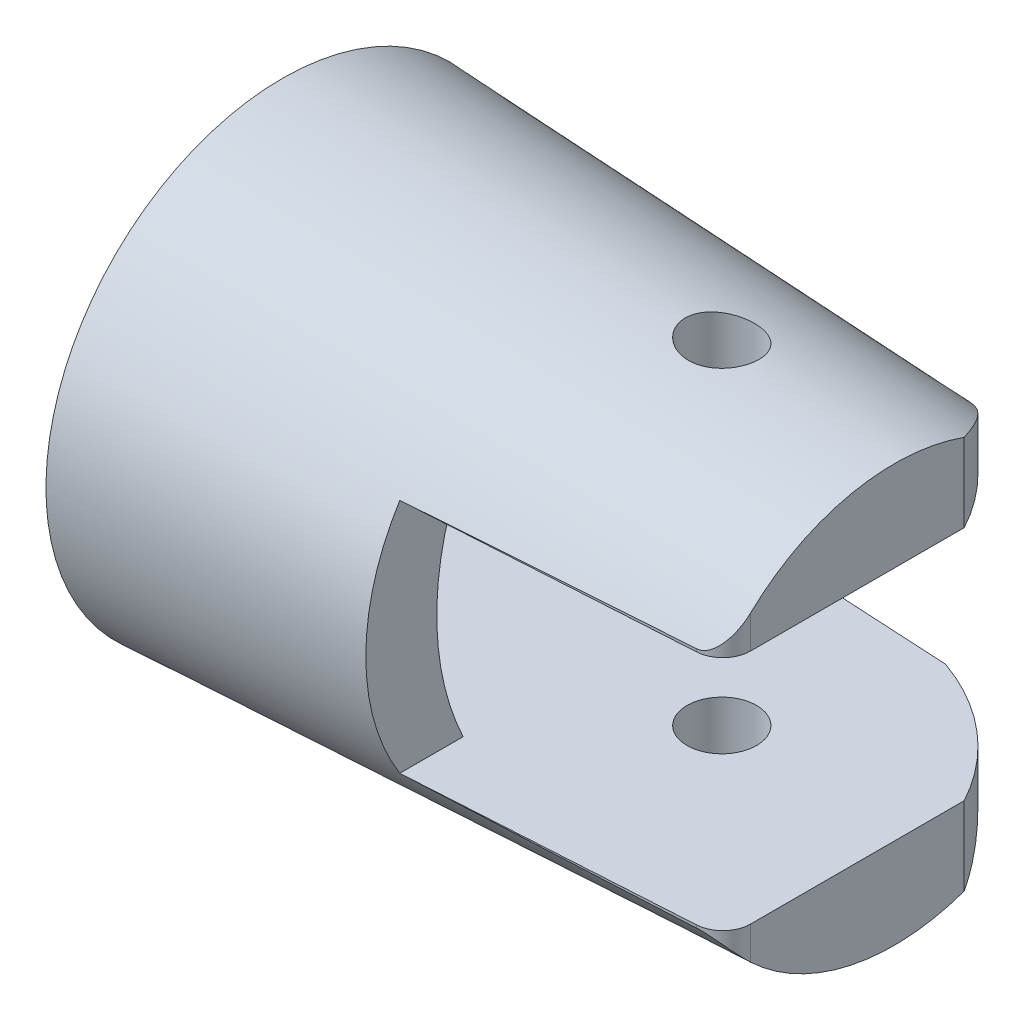
ISO-10303-21;
HEADER;
FILE_DESCRIPTION(('STEP AP214'),'2;1');
FILE_NAME('part.step','',(''),(''),'','','');
FILE_SCHEMA(('AUTOMOTIVE_DESIGN { 1 0 10303 214 1 1 1 1 }'));
ENDSEC;
DATA;
#1=APPLICATION_CONTEXT('core data for automotive mechanical design processes');
#2=APPLICATION_PROTOCOL_DEFINITION('international standard','automotive_design',2000,#1);
#3=PRODUCT_CONTEXT('',#1,'mechanical');
#4=PRODUCT('Part','Part','',(#3));
#5=PRODUCT_RELATED_PRODUCT_CATEGORY('part','',(#4));
#6=PRODUCT_DEFINITION_FORMATION('','',#4);
#7=PRODUCT_DEFINITION_CONTEXT('part definition',#1,'design');
#8=PRODUCT_DEFINITION('design','',#6,#7);
#9=PRODUCT_DEFINITION_SHAPE('','',#8);
#10=(LENGTH_UNIT() NAMED_UNIT(*) SI_UNIT(.MILLI.,.METRE.));
#11=(NAMED_UNIT(*) PLANE_ANGLE_UNIT() SI_UNIT($,.RADIAN.));
#12=(NAMED_UNIT(*) SI_UNIT($,.STERADIAN.) SOLID_ANGLE_UNIT());
#13=UNCERTAINTY_MEASURE_WITH_UNIT(LENGTH_MEASURE(1.E-05),#10,'distance_accuracy_value','');
#14=(GEOMETRIC_REPRESENTATION_CONTEXT(3) GLOBAL_UNCERTAINTY_ASSIGNED_CONTEXT((#13)) GLOBAL_UNIT_ASSIGNED_CONTEXT((#10,
#11,#12)) REPRESENTATION_CONTEXT('',''));
#15=CARTESIAN_POINT('',(0.,0.,0.));
#16=DIRECTION('',(0.,0.,1.));
#17=DIRECTION('',(1.,0.,0.));
#18=AXIS2_PLACEMENT_3D('',#15,#16,#17);
#19=CARTESIAN_POINT('',(11.,4.25,10.));
#20=DIRECTION('',(1.,0.,0.));
#21=DIRECTION('',(0.,1.,0.));
#22=AXIS2_PLACEMENT_3D('',#19,#20,#21);
#23=PLANE('',#22);
#24=CARTESIAN_POINT('',(11.,0.,4.55193349511584));
#25=DIRECTION('',(1.,0.,0.));
#26=DIRECTION('',(0.,1.,0.));
#27=AXIS2_PLACEMENT_3D('',#24,#25,#26);
#28=CIRCLE('',#27,10.);
#29=CARTESIAN_POINT('',(11.,-4.25,-4.5));
#30=VERTEX_POINT('',#29);
#31=CARTESIAN_POINT('',(11.,4.25,-4.5));
#32=VERTEX_POINT('',#31);
#33=EDGE_CURVE('E358',#30,#32,#28,.T.);
#34=ORIENTED_EDGE('',*,*,#33,.F.);
#35=DIRECTION('',(0.,0.,-1.));
#36=VECTOR('',#35,1.);
#37=CARTESIAN_POINT('',(11.,-4.25,10.));
#38=LINE('',#37,#36);
#39=CARTESIAN_POINT('',(11.,-4.25,-6.77772085586298));
#40=VERTEX_POINT('',#39);
#41=EDGE_CURVE('E238',#30,#40,#38,.T.);
#42=ORIENTED_EDGE('',*,*,#41,.T.);
#43=CARTESIAN_POINT('',(11.,0.,0.));
#44=DIRECTION('',(1.,0.,0.));
#45=DIRECTION('',(0.,1.,0.));
#46=AXIS2_PLACEMENT_3D('',#43,#44,#45);
#47=CIRCLE('',#46,8.);
#48=CARTESIAN_POINT('',(11.,4.25,-6.77772085586298));
#49=VERTEX_POINT('',#48);
#50=EDGE_CURVE('E272',#49,#40,#47,.F.);
#51=ORIENTED_EDGE('',*,*,#50,.F.);
#52=DIRECTION('',(0.,0.,-1.));
#53=VECTOR('',#52,1.);
#54=CARTESIAN_POINT('',(11.,4.25,10.));
#55=LINE('',#54,#53);
#56=EDGE_CURVE('E243',#32,#49,#55,.T.);
#57=ORIENTED_EDGE('',*,*,#56,.F.);
#58=EDGE_LOOP('',(#34,#42,#51,#57));
#59=FACE_BOUND('',#58,.T.);
#60=ADVANCED_FACE('F37',(#59),#23,.T.);
#61=CARTESIAN_POINT('',(22.,0.,0.));
#62=DIRECTION('',(-1.,0.,0.));
#63=DIRECTION('',(0.,0.,1.));
#64=AXIS2_PLACEMENT_3D('',#61,#62,#63);
#65=CONICAL_SURFACE('',#64,7.5,0.0454232794215771);
#66=CARTESIAN_POINT('',(14.3941608058607,7.72670680728281,-1.3613683035503));
#67=CARTESIAN_POINT('',(14.4426544610222,7.71548391465483,-1.41236224751293));
#68=CARTESIAN_POINT('',(14.4954875015183,7.70424887281371,-1.45928133671162));
#69=CARTESIAN_POINT('',(14.6084357930975,7.68255265581266,-1.54365513310372));
#70=CARTESIAN_POINT('',(14.6685576532198,7.67209219704693,-1.58110115433035));
#71=CARTESIAN_POINT('',(14.7945004050362,7.65270240022359,-1.64541249257932));
#72=CARTESIAN_POINT('',(14.8603243886682,7.6437739007807,-1.6722720247865));
#73=CARTESIAN_POINT('',(14.9957956663847,7.62810428660344,-1.71449202486371));
#74=CARTESIAN_POINT('',(15.0654416940765,7.62136245239683,-1.72985627717164));
#75=CARTESIAN_POINT('',(15.2052745443432,7.61061659800694,-1.7483636127346));
#76=CARTESIAN_POINT('',(15.2754294883197,7.60656582739482,-1.75172008191131));
#77=CARTESIAN_POINT('',(15.4154144807582,7.60120792507606,-1.74662884758367));
#78=CARTESIAN_POINT('',(15.4852445573659,7.5999005510994,-1.73818218652642));
#79=CARTESIAN_POINT('',(15.6210962962799,7.5999596993806,-1.71000508689467));
#80=CARTESIAN_POINT('',(15.6871665577638,7.60127230540466,-1.69050796574165));
#81=CARTESIAN_POINT('',(15.8151407205646,7.60616665832593,-1.64098116687197));
#82=CARTESIAN_POINT('',(15.877044523267,7.60974845891104,-1.61095123996238));
#83=CARTESIAN_POINT('',(15.9953016125434,7.61872631762937,-1.54105606438817));
#84=CARTESIAN_POINT('',(16.0516250295774,7.62413152144849,-1.50114151098108));
#85=CARTESIAN_POINT('',(16.1568791120356,7.63615109912074,-1.4126804312775));
#86=CARTESIAN_POINT('',(16.2058089763541,7.64276560383257,-1.36413297082777));
#87=CARTESIAN_POINT('',(16.2958843450537,7.65669376395112,-1.25869304955648));
#88=CARTESIAN_POINT('',(16.3368589163514,7.66401856184166,-1.20165596720991));
#89=CARTESIAN_POINT('',(16.4087041841041,7.67859311962624,-1.08152717717293));
#90=CARTESIAN_POINT('',(16.4395743052492,7.68584287522489,-1.01843512499939));
#91=CARTESIAN_POINT('',(16.4905827653885,7.69975341227731,-0.887306796760356));
#92=CARTESIAN_POINT('',(16.5106193398183,7.7064081347361,-0.819230233652647));
#93=CARTESIAN_POINT('',(16.5389103215115,7.71859753901097,-0.680574166422824));
#94=CARTESIAN_POINT('',(16.5471652593735,7.72413227125738,-0.609994775164987));
#95=CARTESIAN_POINT('',(16.55159144621,7.73377753235231,-0.468841500658779));
#96=CARTESIAN_POINT('',(16.5478442256729,7.73789746090987,-0.398270823100492));
#97=CARTESIAN_POINT('',(16.5285102016494,7.74469956105422,-0.258700387536735));
#98=CARTESIAN_POINT('',(16.5129239023689,7.74738179386167,-0.189700562760261));
#99=CARTESIAN_POINT('',(16.4705049686676,7.75142718385602,-0.0558015186554819));
#100=CARTESIAN_POINT('',(16.4437605463657,7.75280041577325,0.00912536689174029));
#101=CARTESIAN_POINT('',(16.3797878281616,7.75456327901398,0.133604971437674));
#102=CARTESIAN_POINT('',(16.3425594055366,7.75495289844774,0.193157625465192));
#103=CARTESIAN_POINT('',(16.2586255688101,7.75516876550879,0.305261109208858));
#104=CARTESIAN_POINT('',(16.2119100087218,7.75499440698649,0.357804342200148));
#105=CARTESIAN_POINT('',(16.1103443963527,7.75456355041053,0.454332452913679));
#106=CARTESIAN_POINT('',(16.0554942086795,7.75430705098963,0.498317188160636));
#107=CARTESIAN_POINT('',(15.939021349308,7.75418860682466,0.57661086018674));
#108=CARTESIAN_POINT('',(15.8773778956546,7.75432790703411,0.610888892786278));
#109=CARTESIAN_POINT('',(15.7492173163487,7.75541223398067,0.66860716351645));
#110=CARTESIAN_POINT('',(15.6827002981538,7.75635724295753,0.692047640521728));
#111=CARTESIAN_POINT('',(15.5468267869638,7.75932580303462,0.727393548443848));
#112=CARTESIAN_POINT('',(15.4774759181103,7.76134730533856,0.739320770655909));
#113=CARTESIAN_POINT('',(15.3378009997418,7.76656649669065,0.751393152829393));
#114=CARTESIAN_POINT('',(15.267476958407,7.76976417585802,0.75153841176592));
#115=CARTESIAN_POINT('',(15.1279457304728,7.77723506449965,0.740077154739874));
#116=CARTESIAN_POINT('',(15.0587372122685,7.78150687207276,0.728485897490286));
#117=CARTESIAN_POINT('',(14.9232764754286,7.79084594374268,0.693928789936077));
#118=CARTESIAN_POINT('',(14.8570243844216,7.79591324213818,0.670962449086993));
#119=CARTESIAN_POINT('',(14.7289689047717,7.80643223064901,0.614161294897967));
#120=CARTESIAN_POINT('',(14.6671907087978,7.81188579985567,0.580270032553416));
#121=CARTESIAN_POINT('',(14.5501786677074,7.82259638910764,0.502596395951323));
#122=CARTESIAN_POINT('',(14.4949450672019,7.82785340180142,0.458813652167071));
#123=CARTESIAN_POINT('',(14.3923902104396,7.83757639572609,0.36238913867351));
#124=CARTESIAN_POINT('',(14.3450970567979,7.8420395706023,0.309717174181918));
#125=CARTESIAN_POINT('',(14.2600260003792,7.84954528170578,0.197089377137391));
#126=CARTESIAN_POINT('',(14.2222475199498,7.85258790418682,0.137133987101617));
#127=CARTESIAN_POINT('',(14.1576199454335,7.85670817861837,0.0122188465916005));
#128=CARTESIAN_POINT('',(14.1306753635887,7.85780330302165,-0.0526908994048998));
#129=CARTESIAN_POINT('',(14.0880311494977,7.85771417888059,-0.186098663533036));
#130=CARTESIAN_POINT('',(14.0723300355759,7.85653023075061,-0.254596207583804));
#131=CARTESIAN_POINT('',(14.0527428234861,7.85174599895401,-0.39222320838502));
#132=CARTESIAN_POINT('',(14.0486992934148,7.84817872156394,-0.461331478045965));
#133=CARTESIAN_POINT('',(14.0520317205128,7.8387122382862,-0.59912127476626));
#134=CARTESIAN_POINT('',(14.0594097262756,7.83281261420469,-0.667802723051398));
#135=CARTESIAN_POINT('',(14.085313547808,7.81893148853445,-0.802958608701167));
#136=CARTESIAN_POINT('',(14.1038637857658,7.8109454478146,-0.869427873409936));
#137=CARTESIAN_POINT('',(14.1515181961402,7.79335206099926,-0.998193216392168));
#138=CARTESIAN_POINT('',(14.1806145517917,7.78374591853286,-1.06049234515243));
#139=CARTESIAN_POINT('',(14.2395097634693,7.76618472073678,-1.16362595288836));
#140=CARTESIAN_POINT('',(14.2670937322044,7.7584636134234,-1.20578401219025));
#141=CARTESIAN_POINT('',(14.3271006909368,7.74273267924434,-1.28644384837905));
#142=CARTESIAN_POINT('',(14.3595238498511,7.73472284230764,-1.32494549755828));
#143=CARTESIAN_POINT('',(14.3941608058607,7.72670680728281,-1.3613683035503));
#144=B_SPLINE_CURVE_WITH_KNOTS('',3,(#66,#67,#68,#69,#70,#71,#72,#73,#74,#75,#76,#77,#78,#79,
#80,#81,#82,#83,#84,#85,#86,#87,#88,#89,#90,#91,#92,#93,#94,#95,#96,#97,#98,#99,#100,#101,#102,
#103,#104,#105,#106,#107,#108,#109,#110,#111,#112,#113,#114,#115,#116,#117,#118,#119,#120,#121,
#122,#123,#124,#125,#126,#127,#128,#129,#130,#131,#132,#133,#134,#135,#136,#137,#138,#139,#140,
#141,#142,#143),.UNSPECIFIED.,.T.,.F.,(4,2,2,2,2,2,2,2,2,2,2,2,2,2,2,2,2,2,2,2,2,2,2,2,2,2,2,2,
2,2,2,2,2,2,2,2,2,2,4),(0.,0.213598980507936,0.427393108302086,0.641303899000289,
0.855144235672321,1.06516507751633,1.27516737158719,1.48089260445746,1.68662270485653,
1.89340042424705,2.10020053235849,2.31104460040675,2.52190067104616,2.73470444135541,
2.94749862751608,3.15885037936939,3.37019313062263,3.57989582553957,3.78960105529513,
3.99953174591391,4.20946593099834,4.42006117623596,4.63065177944319,4.84084300881351,
5.05103247245936,5.26094901799704,5.47087461686302,5.68190277024383,5.89293880853433,
6.10470667679812,6.31646168516635,6.52630711039981,6.73612487689817,6.94309553753699,
7.15010332522128,7.35756527696697,7.56487377165997,7.71743311505977,7.86999778495149),.UNSPECIFIED.);
#145=CARTESIAN_POINT('',(14.3941608058607,7.72670680728281,-1.3613683035503));
#146=VERTEX_POINT('',#145);
#147=EDGE_CURVE('E175',#146,#146,#144,.T.);
#148=ORIENTED_EDGE('',*,*,#147,.T.);
#149=EDGE_LOOP('',(#148));
#150=FACE_BOUND('',#149,.T.);
#151=CARTESIAN_POINT('',(0.,0.,0.));
#152=DIRECTION('',(1.,0.,0.));
#153=DIRECTION('',(0.,0.,-1.));
#154=AXIS2_PLACEMENT_3D('',#151,#152,#153);
#155=CIRCLE('',#154,8.5);
#156=CARTESIAN_POINT('',(0.,0.,-8.5));
#157=VERTEX_POINT('',#156);
#158=EDGE_CURVE('E318',#157,#157,#155,.T.);
#159=ORIENTED_EDGE('',*,*,#158,.T.);
#160=EDGE_LOOP('',(#159));
#161=FACE_BOUND('',#160,.T.);
#162=CARTESIAN_POINT('',(22.,0.,0.));
#163=DIRECTION('',(1.,0.,0.));
#164=DIRECTION('',(0.,0.,-1.));
#165=AXIS2_PLACEMENT_3D('',#162,#163,#164);
#166=CIRCLE('',#165,7.5);
#167=CARTESIAN_POINT('',(22.,-5.43882181659105,5.16422557510437));
#168=VERTEX_POINT('',#167);
#169=CARTESIAN_POINT('',(21.9999999999997,-7.06487109446774,-2.51745832508791));
#170=VERTEX_POINT('',#169);
#171=EDGE_CURVE('E322',#168,#170,#166,.T.);
#172=ORIENTED_EDGE('',*,*,#171,.F.);
#173=CARTESIAN_POINT('',(21.9999999999997,-5.4388214035423,5.16422518296505));
#174=CARTESIAN_POINT('',(21.999988003325,-5.40122433759032,5.20383005545118));
#175=CARTESIAN_POINT('',(21.9976475021436,-5.36327398371906,5.24307901185118));
#176=CARTESIAN_POINT('',(21.9884676916384,-5.28693546590577,5.32063117425536));
#177=CARTESIAN_POINT('',(21.9816274974216,-5.24854721730844,5.35893419269731));
#178=CARTESIAN_POINT('',(21.9635269369551,-5.1712764715488,5.43467828088512));
#179=CARTESIAN_POINT('',(21.9522280107373,-5.13239260596851,5.47210873056726));
#180=CARTESIAN_POINT('',(21.9252776384547,-5.05479542039129,5.5455257191846));
#181=CARTESIAN_POINT('',(21.9096270638205,-5.01608206782372,5.58151254556037));
#182=CARTESIAN_POINT('',(21.8632611799505,-4.91611870549036,5.67291560545291));
#183=CARTESIAN_POINT('',(21.8291362822063,-4.85525150425474,5.72706601404801));
#184=CARTESIAN_POINT('',(21.7490533016696,-4.73700759106305,5.82992881193545));
#185=CARTESIAN_POINT('',(21.7031377874961,-4.67961922184147,5.87865987847763));
#186=CARTESIAN_POINT('',(21.619557864228,-4.5941494275489,5.95022715826886));
#187=CARTESIAN_POINT('',(21.5863107740471,-4.56374880396911,5.9754491951708));
#188=CARTESIAN_POINT('',(21.5146667784949,-4.50666004104465,6.02268787020079));
#189=CARTESIAN_POINT('',(21.4762744908226,-4.47996861603091,6.04470734602649));
#190=CARTESIAN_POINT('',(21.403376261858,-4.43761452517629,6.07994105728659));
#191=CARTESIAN_POINT('',(21.369953905225,-4.42082272605749,6.09402052716756));
#192=CARTESIAN_POINT('',(21.3000849240776,-4.39183504171271,6.11885386930177));
#193=CARTESIAN_POINT('',(21.2636492430545,-4.37962334642304,6.12961915827841));
#194=CARTESIAN_POINT('',(21.1994932868563,-4.36374806339623,6.14450246364224));
#195=CARTESIAN_POINT('',(21.1723707491005,-4.35862572076493,6.14964452883505));
#196=CARTESIAN_POINT('',(21.1172304633357,-4.35153841039494,6.15772915553266));
#197=CARTESIAN_POINT('',(21.0892082831503,-4.34959278287497,6.16065818627176));
#198=CARTESIAN_POINT('',(21.0610485395349,-4.34940519150892,6.16236076572379));
#199=B_SPLINE_CURVE_WITH_KNOTS('',3,(#173,#174,#175,#176,#177,#178,#179,#180,#181,#182,#183,
#184,#185,#186,#187,#188,#189,#190,#191,#192,#193,#194,#195,#196,#197,#198),.UNSPECIFIED.,.F.,
.F.,(4,2,2,2,2,2,2,2,2,2,2,2,4),(0.,0.16375200323083,0.327536218961523,0.492769055887851,
0.657968828250637,0.922066946237122,1.18522465633726,1.33975800572195,1.49415358224953,
1.61364458887854,1.7327192428774,1.81668582207117,1.90116171903795),.UNSPECIFIED.);
#200=CARTESIAN_POINT('',(21.0610485395349,-4.34940519150908,6.16236076572379));
#201=VERTEX_POINT('',#200);
#202=EDGE_CURVE('E310',#168,#201,#199,.T.);
#203=ORIENTED_EDGE('',*,*,#202,.T.);
#204=CARTESIAN_POINT('',(41.3966504623891,0.,4.91858206978472));
#205=DIRECTION('',(0.0610485395348605,0.,0.998134798421867));
#206=DIRECTION('',(-0.998134798421867,0.,0.0610485395348605));
#207=AXIS2_PLACEMENT_3D('',#204,#205,#206);
#208=ELLIPSE('',#207,108.411013929542,4.42830625448139);
#209=CARTESIAN_POINT('',(11.,-4.25,6.77772085586298));
#210=VERTEX_POINT('',#209);
#211=EDGE_CURVE('E382',#201,#210,#208,.F.);
#212=ORIENTED_EDGE('',*,*,#211,.T.);
#213=CARTESIAN_POINT('',(11.,4.25,6.77772085586298));
#214=VERTEX_POINT('',#213);
#215=EDGE_CURVE('E267',#210,#214,#47,.F.);
#216=ORIENTED_EDGE('',*,*,#215,.T.);
#217=CARTESIAN_POINT('',(21.0610485395349,4.34940519150908,6.16236076572378));
#218=VERTEX_POINT('',#217);
#219=EDGE_CURVE('E379',#214,#218,#208,.F.);
#220=ORIENTED_EDGE('',*,*,#219,.T.);
#221=CARTESIAN_POINT('',(21.0610485395349,4.34940519150908,6.16236076572379));
#222=CARTESIAN_POINT('',(21.0960037714883,4.3496066881764,6.16026639709523));
#223=CARTESIAN_POINT('',(21.1307027635223,4.35255770840594,6.15626033932819));
#224=CARTESIAN_POINT('',(21.1984264149009,4.36323729220078,6.14492437754306));
#225=CARTESIAN_POINT('',(21.2314649684895,4.37091464928781,6.13763032047625));
#226=CARTESIAN_POINT('',(21.3034159998717,4.3927674187494,6.11798905969386));
#227=CARTESIAN_POINT('',(21.3417552703831,4.40808163224185,6.10483757135842));
#228=CARTESIAN_POINT('',(21.4147941627067,4.44349099131198,6.07500114310342));
#229=CARTESIAN_POINT('',(21.4494762264571,4.46360781026395,6.05830022381526));
#230=CARTESIAN_POINT('',(21.5317973235916,4.51834985809769,6.01298583576449));
#231=CARTESIAN_POINT('',(21.5770255303745,4.55514250711397,5.98264043640859));
#232=CARTESIAN_POINT('',(21.6597061595097,4.63324615227992,5.91759225288069));
#233=CARTESIAN_POINT('',(21.6971420868919,4.67456645627665,5.88288046988472));
#234=CARTESIAN_POINT('',(21.7828896509989,4.78221980236065,5.79100629877265));
#235=CARTESIAN_POINT('',(21.8266110984243,4.85030746835379,5.73161575597995));
#236=CARTESIAN_POINT('',(21.8995032525744,4.98881469902551,5.60704864762345));
#237=CARTESIAN_POINT('',(21.9286643838315,5.05923576587395,5.54186830754513));
#238=CARTESIAN_POINT('',(21.9668930634414,5.1817212359056,5.42471290103701));
#239=CARTESIAN_POINT('',(21.9792240430582,5.23375859656199,5.3737551214798));
#240=CARTESIAN_POINT('',(21.9957402272397,5.33701405608631,5.27015891537564));
#241=CARTESIAN_POINT('',(21.9999585068014,5.38823463353793,5.21752820599076));
#242=CARTESIAN_POINT('',(21.9999999999995,5.43882157834548,5.1642249988671));
#243=B_SPLINE_CURVE_WITH_KNOTS('',3,(#221,#222,#223,#224,#225,#226,#227,#228,#229,#230,#231,
#232,#233,#234,#235,#236,#237,#238,#239,#240,#241,#242),.UNSPECIFIED.,.F.,.F.,(4,2,2,2,2,2,2,2,
2,2,4),(0.,0.104713635229168,0.208312266464568,0.337583019397052,0.467448560866493,
0.663534383733639,0.860031158880612,1.15956187798788,1.45928932231264,1.68044771343479,
1.90070252749676),.UNSPECIFIED.);
#244=CARTESIAN_POINT('',(22.,5.4388220882811,5.16422548311504));
#245=VERTEX_POINT('',#244);
#246=EDGE_CURVE('E388',#218,#245,#243,.T.);
#247=ORIENTED_EDGE('',*,*,#246,.T.);
#248=CARTESIAN_POINT('',(21.9999999999998,7.06487109446779,-2.51745832508774));
#249=VERTEX_POINT('',#248);
#250=EDGE_CURVE('E42',#249,#245,#166,.T.);
#251=ORIENTED_EDGE('',*,*,#250,.F.);
#252=CARTESIAN_POINT('',(22.0003080623876,7.06505968234685,-2.51688729237845));
#253=CARTESIAN_POINT('',(21.8881291318428,6.99639764470201,-2.72485269624597));
#254=CARTESIAN_POINT('',(21.7682305590175,6.92035246165218,-2.92596695909095));
#255=CARTESIAN_POINT('',(21.5148363388268,6.75610598306857,-3.3136790861146));
#256=CARTESIAN_POINT('',(21.3813636765715,6.66792515033003,-3.50030057601251));
#257=CARTESIAN_POINT('',(21.1026968832155,6.48205113047576,-3.85837200956835));
#258=CARTESIAN_POINT('',(20.9575390671146,6.38438723342633,-4.02986573141752));
#259=CARTESIAN_POINT('',(20.6563188067457,6.18157886445509,-4.35834563870009));
#260=CARTESIAN_POINT('',(20.5002516289551,6.07643114497196,-4.51532545713794));
#261=CARTESIAN_POINT('',(20.1792708213027,5.8616787075006,-4.81378161505556));
#262=CARTESIAN_POINT('',(20.0144247384127,5.75210925281933,-4.95535633209411));
#263=CARTESIAN_POINT('',(19.675452463781,5.5301101043131,-5.22439558629887));
#264=CARTESIAN_POINT('',(19.501326940623,5.41768061685776,-5.3518611379997));
#265=CARTESIAN_POINT('',(19.1440947259196,5.19254517157544,-5.59272862750464));
#266=CARTESIAN_POINT('',(18.9609967216762,5.07983957776,-5.70614380780091));
#267=CARTESIAN_POINT('',(18.5853775699432,4.85698519795744,-5.91908583948866));
#268=CARTESIAN_POINT('',(18.3928570853007,4.74683623291946,-6.01861366592811));
#269=CARTESIAN_POINT('',(18.0659674783814,4.56992783077281,-6.17159460960202));
#270=CARTESIAN_POINT('',(17.9344793579807,4.50132192314888,-6.229088580989));
#271=CARTESIAN_POINT('',(17.6669555808716,4.36833535828526,-6.33783243440865));
#272=CARTESIAN_POINT('',(17.5309227368773,4.30395215815352,-6.38908609055213));
#273=CARTESIAN_POINT('',(17.2538083576219,4.18104154315241,-6.48517562109592));
#274=CARTESIAN_POINT('',(17.1127222697409,4.12251959869401,-6.53000551658752));
#275=CARTESIAN_POINT('',(16.8252347229492,4.01357914037379,-6.61282707777698));
#276=CARTESIAN_POINT('',(16.6788246058615,3.96317462262207,-6.65080694585779));
#277=CARTESIAN_POINT('',(16.5298,3.91802444735892,-6.68510215405462));
#278=B_SPLINE_CURVE_WITH_KNOTS('',3,(#252,#253,#254,#255,#256,#257,#258,#259,#260,#261,#262,
#263,#264,#265,#266,#267,#268,#269,#270,#271,#272,#273,#274,#275,#276,#277),.UNSPECIFIED.,.F.,
.F.,(4,2,2,2,2,2,2,2,2,2,2,2,4),(0.,0.737566643728739,1.47390452257815,2.2080363668748,
2.9424887489158,3.67193516991131,4.40132910516146,5.13003026939157,5.85868024485552,
6.33566848757984,6.81236680195672,7.28950596028758,7.76745919463019),.UNSPECIFIED.);
#279=CARTESIAN_POINT('',(17.4092380949309,4.25,-6.43126025905612));
#280=VERTEX_POINT('',#279);
#281=EDGE_CURVE('E233',#249,#280,#278,.T.);
#282=ORIENTED_EDGE('',*,*,#281,.T.);
#283=CARTESIAN_POINT('',(42.2489789704908,4.25,-5.02280092276018));
#284=CARTESIAN_POINT('',(40.1547448333156,4.25,-5.14746541005266));
#285=CARTESIAN_POINT('',(38.0604008324083,4.25,-5.27026605108917));
#286=CARTESIAN_POINT('',(33.8715355023613,4.25,-5.5127282016366));
#287=CARTESIAN_POINT('',(31.7770141736128,4.25,-5.63238971789931));
#288=CARTESIAN_POINT('',(26.4386502473781,4.25,-5.93411425957757));
#289=CARTESIAN_POINT('',(23.1947070161018,4.25,-6.11439444370026));
#290=CARTESIAN_POINT('',(16.7065626101719,4.25,-6.47027431324399));
#291=CARTESIAN_POINT('',(13.4623614353662,4.25,-6.64587399588557));
#292=CARTESIAN_POINT('',(6.97374000545331,4.25,-6.99340072100294));
#293=CARTESIAN_POINT('',(3.72931974897434,4.25,-7.16532773782434));
#294=CARTESIAN_POINT('',(-2.75967363040063,4.25,-7.50618883644345));
#295=CARTESIAN_POINT('',(-6.00424675308124,4.25,-7.67512292233899));
#296=CARTESIAN_POINT('',(-9.2488789704909,4.25,-7.84290126169988));
#297=B_SPLINE_CURVE_WITH_KNOTS('',3,(#283,#284,#285,#286,#287,#288,#289,#290,#291,#292,#293,
#294,#295,#296),.UNSPECIFIED.,.F.,.F.,(4,2,2,2,2,2,4),(0.,6.29382157713554,12.5876296160741,
22.3344714842286,32.081319140289,41.8282348579779,51.575137229494),.UNSPECIFIED.);
#298=EDGE_CURVE('E269',#280,#49,#297,.T.);
#299=ORIENTED_EDGE('',*,*,#298,.T.);
#300=ORIENTED_EDGE('',*,*,#50,.T.);
#301=CARTESIAN_POINT('',(-9.24887897049089,-4.25,-7.84290126169988));
#302=CARTESIAN_POINT('',(-6.40835558097307,-4.25,-7.69602971930409));
#303=CARTESIAN_POINT('',(-3.56787831836642,-4.25,-7.54825941333675));
#304=CARTESIAN_POINT('',(2.11295350809265,-4.25,-7.25048694328306));
#305=CARTESIAN_POINT('',(4.95330807217746,-4.25,-7.10048478362793));
#306=CARTESIAN_POINT('',(10.6652828942281,-4.25,-6.79614024291575));
#307=CARTESIAN_POINT('',(13.5369015747856,-4.25,-6.64176820996603));
#308=CARTESIAN_POINT('',(19.2799558540304,-4.25,-6.32966709445271));
#309=CARTESIAN_POINT('',(22.1513914527715,-4.25,-6.17193801287818));
#310=CARTESIAN_POINT('',(27.8940408836191,-4.25,-5.85227670093419));
#311=CARTESIAN_POINT('',(30.7652547147977,-4.25,-5.69034445384188));
#312=CARTESIAN_POINT('',(35.0718442738203,-4.25,-5.44338438491273));
#313=CARTESIAN_POINT('',(36.5073364653289,-4.25,-5.36038736069709));
#314=CARTESIAN_POINT('',(39.3782296889704,-4.25,-5.19282448721683));
#315=CARTESIAN_POINT('',(40.8136307210749,-4.25,-5.1082586374663));
#316=CARTESIAN_POINT('',(42.2489789704909,-4.25,-5.02280092276018));
#317=B_SPLINE_CURVE_WITH_KNOTS('',3,(#301,#302,#303,#304,#305,#306,#307,#308,#309,#310,#311,
#312,#313,#314,#315,#316),.UNSPECIFIED.,.F.,.F.,(4,2,2,2,2,2,2,4),(0.,8.53295409703894,
17.0658912546439,25.6931847393306,34.3204756822277,42.9478009552369,47.2614688196322,
51.5751380201726),.UNSPECIFIED.);
#318=CARTESIAN_POINT('',(17.4092380949309,-4.25,-6.43126025905613));
#319=VERTEX_POINT('',#318);
#320=EDGE_CURVE('E328',#40,#319,#317,.T.);
#321=ORIENTED_EDGE('',*,*,#320,.T.);
#322=CARTESIAN_POINT('',(16.5298,-3.91802444735892,-6.68510215405462));
#323=CARTESIAN_POINT('',(16.6456531113715,-3.95309869976283,-6.65844779176537));
#324=CARTESIAN_POINT('',(16.7599478065294,-3.99138613678616,-6.62955258530163));
#325=CARTESIAN_POINT('',(16.9853535840321,-4.07321929478127,-6.56753381809304));
#326=CARTESIAN_POINT('',(17.0964674186333,-4.11676028879647,-6.53441405693512));
#327=CARTESIAN_POINT('',(17.3153278178801,-4.2078644267546,-6.46425486042402));
#328=CARTESIAN_POINT('',(17.4230833590007,-4.25541531066194,-6.42722729150756));
#329=CARTESIAN_POINT('',(17.6357125234829,-4.35374080444329,-6.34931989303674));
#330=CARTESIAN_POINT('',(17.7405854160859,-4.40451622113993,-6.30843909810318));
#331=CARTESIAN_POINT('',(18.0514600420174,-4.56065644250595,-6.18003652482179));
#332=CARTESIAN_POINT('',(18.2533293551601,-4.66966723518062,-6.08688022295515));
#333=CARTESIAN_POINT('',(18.6470730411793,-4.89251360886625,-5.88601032852367));
#334=CARTESIAN_POINT('',(18.8389386255616,-5.00635327809139,-5.77828422497873));
#335=CARTESIAN_POINT('',(19.210957333373,-5.23392636616729,-5.54971659167189));
#336=CARTESIAN_POINT('',(19.3912187416765,-5.34764630392697,-5.42903793716239));
#337=CARTESIAN_POINT('',(19.7424083376948,-5.57346319383886,-5.17352115561093));
#338=CARTESIAN_POINT('',(19.9133387709622,-5.68556053166465,-5.03868645833832));
#339=CARTESIAN_POINT('',(20.2451622390284,-5.90548328788648,-4.75501565238739));
#340=CARTESIAN_POINT('',(20.4060804232523,-6.01331913921597,-4.60621719283079));
#341=CARTESIAN_POINT('',(20.7176105245179,-6.22275628180996,-4.29422050398483));
#342=CARTESIAN_POINT('',(20.8682245665712,-6.32435885810678,-4.13102525971877));
#343=CARTESIAN_POINT('',(21.1978256258668,-6.54576632908104,-3.74346833101005));
#344=CARTESIAN_POINT('',(21.3733238292081,-6.66296152899888,-3.51457592853718));
#345=CARTESIAN_POINT('',(21.7034694125878,-6.8791086309437,-3.0331730401914));
#346=CARTESIAN_POINT('',(21.8580516064331,-6.97800383649907,-2.78059269039445));
#347=CARTESIAN_POINT('',(22.0003080623876,-7.06505968234685,-2.51688729237845));
#348=B_SPLINE_CURVE_WITH_KNOTS('',3,(#322,#323,#324,#325,#326,#327,#328,#329,#330,#331,#332,
#333,#334,#335,#336,#337,#338,#339,#340,#341,#342,#343,#344,#345,#346,#347),.UNSPECIFIED.,.F.,
.F.,(4,2,2,2,2,2,2,2,2,2,2,2,4),(0.,0.371671468498865,0.743010980179795,1.11325367113894,
1.48358936974694,2.22558039082066,2.96821264787948,3.70240946142771,4.43642880024471,
5.16852301895082,5.90046580071163,6.83235829642471,7.76709130470605),.UNSPECIFIED.);
#349=EDGE_CURVE('E400',#319,#170,#348,.T.);
#350=ORIENTED_EDGE('',*,*,#349,.T.);
#351=EDGE_LOOP('',(#172,#203,#212,#216,#220,#247,#251,#282,#299,#300,#321,#350));
#352=FACE_BOUND('',#351,.T.);
#353=CARTESIAN_POINT('',(14.3941608058607,-7.72670680728281,-1.3613683035503));
#354=CARTESIAN_POINT('',(14.3456492727207,-7.73793441814899,-1.310348780955));
#355=CARTESIAN_POINT('',(14.3014278137688,-7.74916185845739,-1.25519493110336));
#356=CARTESIAN_POINT('',(14.2228137745074,-7.77083666864855,-1.13808430385068));
#357=CARTESIAN_POINT('',(14.1884301705355,-7.78128331973828,-1.07612138454399));
#358=CARTESIAN_POINT('',(14.1305327279494,-7.80069591843849,-0.947045141629853));
#359=CARTESIAN_POINT('',(14.1070239939724,-7.80966116941683,-0.87992941650733));
#360=CARTESIAN_POINT('',(14.0716916304675,-7.82553860804923,-0.742470755122228));
#361=CARTESIAN_POINT('',(14.0598643862649,-7.83245143033549,-0.672128824218909));
#362=CARTESIAN_POINT('',(14.0484346375118,-7.84376588803364,-0.531408805331601));
#363=CARTESIAN_POINT('',(14.0486378189612,-7.84820627015646,-0.461049642053067));
#364=CARTESIAN_POINT('',(14.0608588500298,-7.85461466616638,-0.321250660259167));
#365=CARTESIAN_POINT('',(14.0728759319888,-7.85658284067709,-0.251810782306326));
#366=CARTESIAN_POINT('',(14.1080934867068,-7.85813480781043,-0.117085047325288));
#367=CARTESIAN_POINT('',(14.1310977523554,-7.85775908899616,-0.0517482389678593));
#368=CARTESIAN_POINT('',(14.1875450449542,-7.85501383311639,0.074200836274749));
#369=CARTESIAN_POINT('',(14.2209882257769,-7.85264426666015,0.134813033501384));
#370=CARTESIAN_POINT('',(14.2974963386103,-7.84634908987508,0.249850664917319));
#371=CARTESIAN_POINT('',(14.3405959211718,-7.84241783537693,0.304252726382137));
#372=CARTESIAN_POINT('',(14.435139370771,-7.83355068802632,0.405150173778025));
#373=CARTESIAN_POINT('',(14.4865839088842,-7.82861471436933,0.451644923211065));
#374=CARTESIAN_POINT('',(14.5971949521335,-7.81825037808039,0.536086045713962));
#375=CARTESIAN_POINT('',(14.6564606113727,-7.81281602582216,0.573901852912815));
#376=CARTESIAN_POINT('',(14.780495714944,-7.80209784106026,0.63908920290493));
#377=CARTESIAN_POINT('',(14.845265343073,-7.796814013591,0.666460396747991));
#378=CARTESIAN_POINT('',(14.9789081180795,-7.78686068571539,0.710111365364956));
#379=CARTESIAN_POINT('',(15.0478029276005,-7.7821949344372,0.726325749274683));
#380=CARTESIAN_POINT('',(15.1873987073492,-7.77387160442994,0.746915474887315));
#381=CARTESIAN_POINT('',(15.2580996124838,-7.77021398942263,0.751291242658374));
#382=CARTESIAN_POINT('',(15.398912897443,-7.76409560295833,0.748058614130065));
#383=CARTESIAN_POINT('',(15.4690264311448,-7.76162874940676,0.740511978422267));
#384=CARTESIAN_POINT('',(15.6070199742601,-7.757836725121,0.71374551008818));
#385=CARTESIAN_POINT('',(15.6749000206511,-7.75651153547626,0.694525870822705));
#386=CARTESIAN_POINT('',(15.8062255367061,-7.75479188216304,0.645050548483789));
#387=CARTESIAN_POINT('',(15.8696869346537,-7.75439388745814,0.614837242833381));
#388=CARTESIAN_POINT('',(15.9906616396531,-7.75415684622007,0.54421844687185));
#389=CARTESIAN_POINT('',(16.0481748256869,-7.75431781105678,0.503812749251195));
#390=CARTESIAN_POINT('',(16.1557580975588,-7.75474245140842,0.413841861267424));
#391=CARTESIAN_POINT('',(16.2058101830076,-7.755006369935,0.364255146630762));
#392=CARTESIAN_POINT('',(16.2968903189999,-7.75514544483294,0.257389327247779));
#393=CARTESIAN_POINT('',(16.3379183826481,-7.75502060176887,0.200110233672466));
#394=CARTESIAN_POINT('',(16.4098094747949,-7.75392694419512,0.0794463505885511));
#395=CARTESIAN_POINT('',(16.4406656434448,-7.7529575617329,0.0160574777735093));
#396=CARTESIAN_POINT('',(16.4912961449658,-7.74981952556698,-0.114972455473762));
#397=CARTESIAN_POINT('',(16.5110708636376,-7.74765091361967,-0.182613367780041));
#398=CARTESIAN_POINT('',(16.5389389532823,-7.74192544532725,-0.31994119498966));
#399=CARTESIAN_POINT('',(16.5470752384127,-7.73837375077829,-0.389619621651155));
#400=CARTESIAN_POINT('',(16.5516086581664,-7.7298713395206,-0.529270668753315));
#401=CARTESIAN_POINT('',(16.5480057347323,-7.72492061589294,-0.599243290647244));
#402=CARTESIAN_POINT('',(16.5292002766392,-7.71380095438253,-0.737580673310513));
#403=CARTESIAN_POINT('',(16.5139862733384,-7.70763081651263,-0.805943775440859));
#404=CARTESIAN_POINT('',(16.472412476205,-7.69444575621566,-0.939107235094844));
#405=CARTESIAN_POINT('',(16.446051931133,-7.68743077687192,-1.00390735215257));
#406=CARTESIAN_POINT('',(16.3826426815937,-7.67301203438033,-1.12875355172238));
#407=CARTESIAN_POINT('',(16.345498987648,-7.66560531650912,-1.18875105864251));
#408=CARTESIAN_POINT('',(16.2616393919641,-7.65110554928425,-1.30168361792589));
#409=CARTESIAN_POINT('',(16.214923022146,-7.64401251528959,-1.35461832472673));
#410=CARTESIAN_POINT('',(16.1129728127696,-7.63080651237143,-1.45214011511484));
#411=CARTESIAN_POINT('',(16.0577053513327,-7.62469761533997,-1.49669263858327));
#412=CARTESIAN_POINT('',(15.9403206284318,-7.61417683543608,-1.57587180194411));
#413=CARTESIAN_POINT('',(15.8782039984372,-7.60976479628737,-1.61049935582605));
#414=CARTESIAN_POINT('',(15.7497675129464,-7.60326169266432,-1.66837656826506));
#415=CARTESIAN_POINT('',(15.6835151657077,-7.60114030757876,-1.6917725287631));
#416=CARTESIAN_POINT('',(15.5480042525977,-7.59949733370301,-1.72714938498678));
#417=CARTESIAN_POINT('',(15.4787461872571,-7.59997531368595,-1.73913217373584));
#418=CARTESIAN_POINT('',(15.3405652200014,-7.60364218615082,-1.75123007413515));
#419=CARTESIAN_POINT('',(15.271659640768,-7.60678098467346,-1.75155970917162));
#420=CARTESIAN_POINT('',(15.1348777171783,-7.61559540087792,-1.74094349167122));
#421=CARTESIAN_POINT('',(15.0670015671087,-7.62127149141759,-1.72999553691038));
#422=CARTESIAN_POINT('',(14.9340045042183,-7.63483777202758,-1.69718519667677));
#423=CARTESIAN_POINT('',(14.8688908336283,-7.64273341234053,-1.67529583963482));
#424=CARTESIAN_POINT('',(14.743342052603,-7.66020397265513,-1.6212920935379));
#425=CARTESIAN_POINT('',(14.6829035826687,-7.66977767037666,-1.58918513309329));
#426=CARTESIAN_POINT('',(14.583294781149,-7.68729876722651,-1.52535752081469));
#427=CARTESIAN_POINT('',(14.5427088418496,-7.69501250851951,-1.49575206422372));
#428=CARTESIAN_POINT('',(14.465410602032,-7.71071979055969,-1.43191914609076));
#429=CARTESIAN_POINT('',(14.4286984518024,-7.71871334214645,-1.3976915053428));
#430=CARTESIAN_POINT('',(14.3941608058607,-7.72670680728281,-1.3613683035503));
#431=B_SPLINE_CURVE_WITH_KNOTS('',3,(#353,#354,#355,#356,#357,#358,#359,#360,#361,#362,#363,
#364,#365,#366,#367,#368,#369,#370,#371,#372,#373,#374,#375,#376,#377,#378,#379,#380,#381,#382,
#383,#384,#385,#386,#387,#388,#389,#390,#391,#392,#393,#394,#395,#396,#397,#398,#399,#400,#401,
#402,#403,#404,#405,#406,#407,#408,#409,#410,#411,#412,#413,#414,#415,#416,#417,#418,#419,#420,
#421,#422,#423,#424,#425,#426,#427,#428,#429,#430),.UNSPECIFIED.,.T.,.F.,(4,2,2,2,2,2,2,2,2,2,2,
2,2,2,2,2,2,2,2,2,2,2,2,2,2,2,2,2,2,2,2,2,2,2,2,2,2,2,4),(0.,0.213692952015606,
0.427580266244545,0.641567877027882,0.855489251550537,1.06595635103406,1.2764097753975,
1.48323799928607,1.69006927202431,1.89765496514028,2.10525735993834,2.31580357948778,
2.52635683268333,2.7381338759288,2.94990329728222,3.16057929998129,3.37125181297249,
3.5811207009628,3.79099385795392,4.00136542605227,4.21173668864864,4.42224953516799,
4.63275505222733,4.842482357907,5.05221070081544,5.26214646777531,5.4720963859557,
5.68395500043499,5.89582397674633,6.10854822145475,6.3212528701083,6.53110613928692,
6.74092459549901,6.94687844380887,7.15287069034794,7.3593732497823,7.56572601520272,
7.71785819536344,7.86999627551105),.UNSPECIFIED.);
#432=CARTESIAN_POINT('',(14.3941608058607,-7.72670680728281,-1.3613683035503));
#433=VERTEX_POINT('',#432);
#434=EDGE_CURVE('E183',#433,#433,#431,.T.);
#435=ORIENTED_EDGE('',*,*,#434,.T.);
#436=EDGE_LOOP('',(#435));
#437=FACE_BOUND('',#436,.T.);
#438=ADVANCED_FACE('F188',(#150,#161,#352,#437),#65,.T.);
#439=CARTESIAN_POINT('',(22.,0.,0.));
#440=DIRECTION('',(1.,0.,0.));
#441=DIRECTION('',(0.,0.,-1.));
#442=AXIS2_PLACEMENT_3D('',#439,#440,#441);
#443=PLANE('',#442);
#444=ORIENTED_EDGE('',*,*,#250,.T.);
#445=DIRECTION('',(0.,-1.,0.));
#446=VECTOR('',#445,1.);
#447=CARTESIAN_POINT('',(22.,0.,5.16422596730192));
#448=LINE('',#447,#446);
#449=CARTESIAN_POINT('',(22.,4.25,5.16422596730192));
#450=VERTEX_POINT('',#449);
#451=EDGE_CURVE('E316',#245,#450,#448,.T.);
#452=ORIENTED_EDGE('',*,*,#451,.T.);
#453=DIRECTION('',(0.,0.,-1.));
#454=VECTOR('',#453,1.);
#455=CARTESIAN_POINT('',(22.,4.25,0.));
#456=LINE('',#455,#454);
#457=CARTESIAN_POINT('',(22.,4.25,-2.51745832508744));
#458=VERTEX_POINT('',#457);
#459=EDGE_CURVE('E256',#450,#458,#456,.T.);
#460=ORIENTED_EDGE('',*,*,#459,.T.);
#461=DIRECTION('',(0.,-1.,0.));
#462=VECTOR('',#461,1.);
#463=CARTESIAN_POINT('',(22.,10.,-2.51745832508744));
#464=LINE('',#463,#462);
#465=EDGE_CURVE('E235',#458,#249,#464,.F.);
#466=ORIENTED_EDGE('',*,*,#465,.T.);
#467=EDGE_LOOP('',(#444,#452,#460,#466));
#468=FACE_BOUND('',#467,.T.);
#469=ADVANCED_FACE('F289',(#468),#443,.T.);
#470=DIRECTION('',(0.,0.,1.));
#471=VECTOR('',#470,1.);
#472=CARTESIAN_POINT('',(22.,-4.25,0.));
#473=LINE('',#472,#471);
#474=CARTESIAN_POINT('',(22.,-4.25,-2.51745832508744));
#475=VERTEX_POINT('',#474);
#476=CARTESIAN_POINT('',(22.,-4.25,5.16422596730192));
#477=VERTEX_POINT('',#476);
#478=EDGE_CURVE('E247',#475,#477,#473,.T.);
#479=ORIENTED_EDGE('',*,*,#478,.T.);
#480=DIRECTION('',(0.,-1.,0.));
#481=VECTOR('',#480,1.);
#482=CARTESIAN_POINT('',(22.,0.,5.16422596730192));
#483=LINE('',#482,#481);
#484=EDGE_CURVE('E363',#477,#168,#483,.T.);
#485=ORIENTED_EDGE('',*,*,#484,.T.);
#486=ORIENTED_EDGE('',*,*,#171,.T.);
#487=DIRECTION('',(0.,-1.,0.));
#488=VECTOR('',#487,1.);
#489=CARTESIAN_POINT('',(22.,10.,-2.51745832508744));
#490=LINE('',#489,#488);
#491=EDGE_CURVE('E401',#170,#475,#490,.F.);
#492=ORIENTED_EDGE('',*,*,#491,.T.);
#493=EDGE_LOOP('',(#479,#485,#486,#492));
#494=FACE_BOUND('',#493,.T.);
#495=ADVANCED_FACE('F297',(#494),#443,.T.);
#496=CARTESIAN_POINT('',(24.7634100726742,4.25,10.));
#497=DIRECTION('',(0.,-1.,0.));
#498=DIRECTION('',(1.,0.,0.));
#499=AXIS2_PLACEMENT_3D('',#496,#497,#498);
#500=PLANE('',#499);
#501=ORIENTED_EDGE('',*,*,#459,.F.);
#502=CARTESIAN_POINT('',(21.,4.25,5.16422596730192));
#503=DIRECTION('',(0.,-1.,0.));
#504=DIRECTION('',(1.,0.,0.));
#505=AXIS2_PLACEMENT_3D('',#502,#503,#504);
#506=CIRCLE('',#505,1.);
#507=CARTESIAN_POINT('',(21.0610485395349,4.25,6.16236076572379));
#508=VERTEX_POINT('',#507);
#509=EDGE_CURVE('E48',#450,#508,#506,.T.);
#510=ORIENTED_EDGE('',*,*,#509,.T.);
#511=DIRECTION('',(-0.998134798421867,0.,0.0610485395348605));
#512=VECTOR('',#511,1.);
#513=CARTESIAN_POINT('',(24.5157663651021,4.25,5.9510611716315));
#514=LINE('',#513,#512);
#515=EDGE_CURVE('E395',#508,#214,#514,.T.);
#516=ORIENTED_EDGE('',*,*,#515,.T.);
#517=CARTESIAN_POINT('',(11.,4.25,4.5));
#518=VERTEX_POINT('',#517);
#519=EDGE_CURVE('E244',#214,#518,#55,.T.);
#520=ORIENTED_EDGE('',*,*,#519,.T.);
#521=DIRECTION('',(-1.,0.,0.));
#522=VECTOR('',#521,1.);
#523=CARTESIAN_POINT('',(22.0001065009994,4.25,4.5));
#524=LINE('',#523,#522);
#525=CARTESIAN_POINT('',(0.,4.25,4.5));
#526=VERTEX_POINT('',#525);
#527=EDGE_CURVE('E145',#518,#526,#524,.T.);
#528=ORIENTED_EDGE('',*,*,#527,.T.);
#529=DIRECTION('',(0.,0.,-1.));
#530=VECTOR('',#529,1.);
#531=CARTESIAN_POINT('',(0.,4.25,-4.5));
#532=LINE('',#531,#530);
#533=CARTESIAN_POINT('',(0.,4.25,-4.5));
#534=VERTEX_POINT('',#533);
#535=EDGE_CURVE('E162',#526,#534,#532,.T.);
#536=ORIENTED_EDGE('',*,*,#535,.T.);
#537=DIRECTION('',(-1.,0.,0.));
#538=VECTOR('',#537,1.);
#539=CARTESIAN_POINT('',(22.0001065009994,4.25,-4.5));
#540=LINE('',#539,#538);
#541=EDGE_CURVE('E167',#32,#534,#540,.T.);
#542=ORIENTED_EDGE('',*,*,#541,.F.);
#543=ORIENTED_EDGE('',*,*,#56,.T.);
#544=ORIENTED_EDGE('',*,*,#298,.F.);
#545=CARTESIAN_POINT('',(14.6601567888028,4.25,1.44263026420474));
#546=DIRECTION('',(0.,-1.,0.));
#547=DIRECTION('',(1.,0.,0.));
#548=AXIS2_PLACEMENT_3D('',#545,#546,#547);
#549=CIRCLE('',#548,8.34);
#550=EDGE_CURVE('E402',#280,#458,#549,.T.);
#551=ORIENTED_EDGE('',*,*,#550,.T.);
#552=EDGE_LOOP('',(#501,#510,#516,#520,#528,#536,#542,#543,#544,#551));
#553=FACE_BOUND('',#552,.T.);
#554=CARTESIAN_POINT('',(15.3,4.25,-0.5));
#555=DIRECTION('',(0.,-1.,0.));
#556=DIRECTION('',(1.,0.,0.));
#557=AXIS2_PLACEMENT_3D('',#554,#555,#556);
#558=CIRCLE('',#557,1.25);
#559=CARTESIAN_POINT('',(16.55,4.25,-0.5));
#560=VERTEX_POINT('',#559);
#561=EDGE_CURVE('E172',#560,#560,#558,.F.);
#562=ORIENTED_EDGE('',*,*,#561,.T.);
#563=EDGE_LOOP('',(#562));
#564=FACE_BOUND('',#563,.T.);
#565=ADVANCED_FACE('F343',(#553,#564),#500,.T.);
#566=CARTESIAN_POINT('',(11.,-4.25,10.));
#567=DIRECTION('',(0.,1.,0.));
#568=DIRECTION('',(0.,0.,1.));
#569=AXIS2_PLACEMENT_3D('',#566,#567,#568);
#570=PLANE('',#569);
#571=DIRECTION('',(0.998134798421867,0.,-0.0610485395348605));
#572=VECTOR('',#571,1.);
#573=CARTESIAN_POINT('',(10.8036514782179,-4.25,6.78973004591785));
#574=LINE('',#573,#572);
#575=CARTESIAN_POINT('',(21.0610485395349,-4.25,6.16236076572379));
#576=VERTEX_POINT('',#575);
#577=EDGE_CURVE('E264',#210,#576,#574,.T.);
#578=ORIENTED_EDGE('',*,*,#577,.T.);
#579=CARTESIAN_POINT('',(21.,-4.25,5.16422596730192));
#580=DIRECTION('',(0.,1.,0.));
#581=DIRECTION('',(0.,0.,1.));
#582=AXIS2_PLACEMENT_3D('',#579,#580,#581);
#583=CIRCLE('',#582,1.);
#584=EDGE_CURVE('E314',#576,#477,#583,.T.);
#585=ORIENTED_EDGE('',*,*,#584,.T.);
#586=ORIENTED_EDGE('',*,*,#478,.F.);
#587=CARTESIAN_POINT('',(14.6601567888028,-4.25,1.44263026420474));
#588=DIRECTION('',(0.,1.,0.));
#589=DIRECTION('',(0.,0.,1.));
#590=AXIS2_PLACEMENT_3D('',#587,#588,#589);
#591=CIRCLE('',#590,8.34);
#592=EDGE_CURVE('E266',#475,#319,#591,.T.);
#593=ORIENTED_EDGE('',*,*,#592,.T.);
#594=ORIENTED_EDGE('',*,*,#320,.F.);
#595=ORIENTED_EDGE('',*,*,#41,.F.);
#596=DIRECTION('',(-1.,0.,0.));
#597=VECTOR('',#596,1.);
#598=CARTESIAN_POINT('',(22.0001065009994,-4.25,-4.5));
#599=LINE('',#598,#597);
#600=CARTESIAN_POINT('',(0.,-4.25,-4.5));
#601=VERTEX_POINT('',#600);
#602=EDGE_CURVE('E146',#30,#601,#599,.T.);
#603=ORIENTED_EDGE('',*,*,#602,.T.);
#604=DIRECTION('',(0.,0.,1.));
#605=VECTOR('',#604,1.);
#606=CARTESIAN_POINT('',(0.,-4.25,-4.5));
#607=LINE('',#606,#605);
#608=CARTESIAN_POINT('',(0.,-4.24999999999999,4.5));
#609=VERTEX_POINT('',#608);
#610=EDGE_CURVE('E150',#601,#609,#607,.T.);
#611=ORIENTED_EDGE('',*,*,#610,.T.);
#612=DIRECTION('',(-1.,0.,0.));
#613=VECTOR('',#612,1.);
#614=CARTESIAN_POINT('',(22.0001065009994,-4.24999999999999,4.5));
#615=LINE('',#614,#613);
#616=CARTESIAN_POINT('',(11.,-4.25,4.5));
#617=VERTEX_POINT('',#616);
#618=EDGE_CURVE('E134',#617,#609,#615,.T.);
#619=ORIENTED_EDGE('',*,*,#618,.F.);
#620=EDGE_CURVE('E241',#210,#617,#38,.T.);
#621=ORIENTED_EDGE('',*,*,#620,.F.);
#622=EDGE_LOOP('',(#578,#585,#586,#593,#594,#595,#603,#611,#619,#621));
#623=FACE_BOUND('',#622,.T.);
#624=CARTESIAN_POINT('',(15.3,-4.25,-0.5));
#625=DIRECTION('',(0.,1.,0.));
#626=DIRECTION('',(0.,0.,1.));
#627=AXIS2_PLACEMENT_3D('',#624,#625,#626);
#628=CIRCLE('',#627,1.25);
#629=CARTESIAN_POINT('',(15.3,-4.25,0.749999999999999));
#630=VERTEX_POINT('',#629);
#631=EDGE_CURVE('E169',#630,#630,#628,.F.);
#632=ORIENTED_EDGE('',*,*,#631,.T.);
#633=EDGE_LOOP('',(#632));
#634=FACE_BOUND('',#633,.T.);
#635=ADVANCED_FACE('F152',(#623,#634),#570,.T.);
#636=CARTESIAN_POINT('',(0.,0.,0.));
#637=DIRECTION('',(1.,0.,0.));
#638=DIRECTION('',(0.,0.,-1.));
#639=AXIS2_PLACEMENT_3D('',#636,#637,#638);
#640=PLANE('',#639);
#641=ORIENTED_EDGE('',*,*,#610,.F.);
#642=CARTESIAN_POINT('',(0.,0.,4.55193349511584));
#643=DIRECTION('',(-1.,0.,0.));
#644=DIRECTION('',(0.,0.,-1.));
#645=AXIS2_PLACEMENT_3D('',#642,#643,#644);
#646=CIRCLE('',#645,10.);
#647=EDGE_CURVE('E157',#534,#601,#646,.T.);
#648=ORIENTED_EDGE('',*,*,#647,.F.);
#649=ORIENTED_EDGE('',*,*,#535,.F.);
#650=CARTESIAN_POINT('',(0.,0.,-4.55193349511584));
#651=DIRECTION('',(-1.,0.,0.));
#652=DIRECTION('',(0.,0.,-1.));
#653=AXIS2_PLACEMENT_3D('',#650,#651,#652);
#654=CIRCLE('',#653,10.);
#655=EDGE_CURVE('E138',#609,#526,#654,.T.);
#656=ORIENTED_EDGE('',*,*,#655,.F.);
#657=EDGE_LOOP('',(#641,#648,#649,#656));
#658=FACE_BOUND('',#657,.T.);
#659=ORIENTED_EDGE('',*,*,#158,.F.);
#660=EDGE_LOOP('',(#659));
#661=FACE_BOUND('',#660,.T.);
#662=ADVANCED_FACE('F159',(#658,#661),#640,.F.);
#663=CARTESIAN_POINT('',(11.,0.,-4.55193349511584));
#664=DIRECTION('',(1.,0.,0.));
#665=DIRECTION('',(0.,1.,0.));
#666=AXIS2_PLACEMENT_3D('',#663,#664,#665);
#667=CIRCLE('',#666,10.);
#668=EDGE_CURVE('E141',#518,#617,#667,.T.);
#669=ORIENTED_EDGE('',*,*,#668,.F.);
#670=ORIENTED_EDGE('',*,*,#519,.F.);
#671=ORIENTED_EDGE('',*,*,#215,.F.);
#672=ORIENTED_EDGE('',*,*,#620,.T.);
#673=EDGE_LOOP('',(#669,#670,#671,#672));
#674=FACE_BOUND('',#673,.T.);
#675=ADVANCED_FACE('F207',(#674),#23,.T.);
#676=CARTESIAN_POINT('',(11.,10.,6.77772085586298));
#677=DIRECTION('',(0.0610485395348605,0.,0.998134798421867));
#678=DIRECTION('',(0.998134798421867,0.,-0.0610485395348605));
#679=AXIS2_PLACEMENT_3D('',#676,#677,#678);
#680=PLANE('',#679);
#681=ORIENTED_EDGE('',*,*,#211,.F.);
#682=DIRECTION('',(0.,-1.,0.));
#683=VECTOR('',#682,1.);
#684=CARTESIAN_POINT('',(21.0610485395349,10.,6.16236076572379));
#685=LINE('',#684,#683);
#686=EDGE_CURVE('E312',#201,#576,#685,.F.);
#687=ORIENTED_EDGE('',*,*,#686,.T.);
#688=ORIENTED_EDGE('',*,*,#577,.F.);
#689=EDGE_LOOP('',(#681,#687,#688));
#690=FACE_BOUND('',#689,.T.);
#691=ADVANCED_FACE('F202',(#690),#680,.T.);
#692=CARTESIAN_POINT('',(14.6601567888028,10.,1.44263026420474));
#693=DIRECTION('',(0.,-1.,0.));
#694=DIRECTION('',(0.,0.,-1.));
#695=AXIS2_PLACEMENT_3D('',#692,#693,#694);
#696=CYLINDRICAL_SURFACE('',#695,8.34);
#697=ORIENTED_EDGE('',*,*,#349,.F.);
#698=ORIENTED_EDGE('',*,*,#592,.F.);
#699=ORIENTED_EDGE('',*,*,#491,.F.);
#700=EDGE_LOOP('',(#697,#698,#699));
#701=FACE_BOUND('',#700,.T.);
#702=ADVANCED_FACE('F206',(#701),#696,.T.);
#703=ORIENTED_EDGE('',*,*,#515,.F.);
#704=DIRECTION('',(0.,-1.,0.));
#705=VECTOR('',#704,1.);
#706=CARTESIAN_POINT('',(21.0610485395349,10.,6.16236076572379));
#707=LINE('',#706,#705);
#708=EDGE_CURVE('E12',#508,#218,#707,.F.);
#709=ORIENTED_EDGE('',*,*,#708,.T.);
#710=ORIENTED_EDGE('',*,*,#219,.F.);
#711=EDGE_LOOP('',(#703,#709,#710));
#712=FACE_BOUND('',#711,.T.);
#713=ADVANCED_FACE('F209',(#712),#680,.T.);
#714=ORIENTED_EDGE('',*,*,#550,.F.);
#715=ORIENTED_EDGE('',*,*,#281,.F.);
#716=ORIENTED_EDGE('',*,*,#465,.F.);
#717=EDGE_LOOP('',(#714,#715,#716));
#718=FACE_BOUND('',#717,.T.);
#719=ADVANCED_FACE('F198',(#718),#696,.T.);
#720=CARTESIAN_POINT('',(15.3,10.,-0.5));
#721=DIRECTION('',(0.,-1.,0.));
#722=DIRECTION('',(0.,0.,-1.));
#723=AXIS2_PLACEMENT_3D('',#720,#721,#722);
#724=CYLINDRICAL_SURFACE('',#723,1.25);
#725=ORIENTED_EDGE('',*,*,#434,.F.);
#726=EDGE_LOOP('',(#725));
#727=FACE_BOUND('',#726,.T.);
#728=ORIENTED_EDGE('',*,*,#631,.F.);
#729=EDGE_LOOP('',(#728));
#730=FACE_BOUND('',#729,.T.);
#731=ADVANCED_FACE('F192',(#727,#730),#724,.F.);
#732=ORIENTED_EDGE('',*,*,#147,.F.);
#733=EDGE_LOOP('',(#732));
#734=FACE_BOUND('',#733,.T.);
#735=ORIENTED_EDGE('',*,*,#561,.F.);
#736=EDGE_LOOP('',(#735));
#737=FACE_BOUND('',#736,.T.);
#738=ADVANCED_FACE('F197',(#734,#737),#724,.F.);
#739=CARTESIAN_POINT('',(22.0001065009994,0.,4.55193349511584));
#740=DIRECTION('',(-1.,0.,0.));
#741=DIRECTION('',(0.,0.,1.));
#742=AXIS2_PLACEMENT_3D('',#739,#740,#741);
#743=CYLINDRICAL_SURFACE('',#742,10.);
#744=ORIENTED_EDGE('',*,*,#33,.T.);
#745=ORIENTED_EDGE('',*,*,#541,.T.);
#746=ORIENTED_EDGE('',*,*,#647,.T.);
#747=ORIENTED_EDGE('',*,*,#602,.F.);
#748=EDGE_LOOP('',(#744,#745,#746,#747));
#749=FACE_BOUND('',#748,.T.);
#750=ADVANCED_FACE('F200',(#749),#743,.F.);
#751=CARTESIAN_POINT('',(22.0001065009994,0.,-4.55193349511584));
#752=DIRECTION('',(-1.,0.,0.));
#753=DIRECTION('',(0.,0.,1.));
#754=AXIS2_PLACEMENT_3D('',#751,#752,#753);
#755=CYLINDRICAL_SURFACE('',#754,10.);
#756=ORIENTED_EDGE('',*,*,#668,.T.);
#757=ORIENTED_EDGE('',*,*,#618,.T.);
#758=ORIENTED_EDGE('',*,*,#655,.T.);
#759=ORIENTED_EDGE('',*,*,#527,.F.);
#760=EDGE_LOOP('',(#756,#757,#758,#759));
#761=FACE_BOUND('',#760,.T.);
#762=ADVANCED_FACE('F136',(#761),#755,.F.);
#763=CARTESIAN_POINT('',(21.,0.,5.16422596730192));
#764=DIRECTION('',(0.,-1.,0.));
#765=DIRECTION('',(0.,0.,-1.));
#766=AXIS2_PLACEMENT_3D('',#763,#764,#765);
#767=CYLINDRICAL_SURFACE('',#766,1.);
#768=ORIENTED_EDGE('',*,*,#584,.F.);
#769=ORIENTED_EDGE('',*,*,#686,.F.);
#770=ORIENTED_EDGE('',*,*,#202,.F.);
#771=ORIENTED_EDGE('',*,*,#484,.F.);
#772=EDGE_LOOP('',(#768,#769,#770,#771));
#773=FACE_BOUND('',#772,.T.);
#774=ADVANCED_FACE('F298',(#773),#767,.T.);
#775=CARTESIAN_POINT('',(21.,0.,5.16422596730192));
#776=DIRECTION('',(0.,-1.,0.));
#777=DIRECTION('',(0.,0.,-1.));
#778=AXIS2_PLACEMENT_3D('',#775,#776,#777);
#779=CYLINDRICAL_SURFACE('',#778,1.);
#780=ORIENTED_EDGE('',*,*,#246,.F.);
#781=ORIENTED_EDGE('',*,*,#708,.F.);
#782=ORIENTED_EDGE('',*,*,#509,.F.);
#783=ORIENTED_EDGE('',*,*,#451,.F.);
#784=EDGE_LOOP('',(#780,#781,#782,#783));
#785=FACE_BOUND('',#784,.T.);
#786=ADVANCED_FACE('F39',(#785),#779,.T.);
#787=CLOSED_SHELL('',(#60,#438,#469,#495,#565,#635,#662,#675,#691,#702,#713,#719,#731,#738,#750,
#762,#774,#786));
#788=MANIFOLD_SOLID_BREP('B2',#787);
#789=ADVANCED_BREP_SHAPE_REPRESENTATION('',(#18,#788),#14);
#790=SHAPE_DEFINITION_REPRESENTATION(#9,#789);
ENDSEC;
END-ISO-10303-21;
